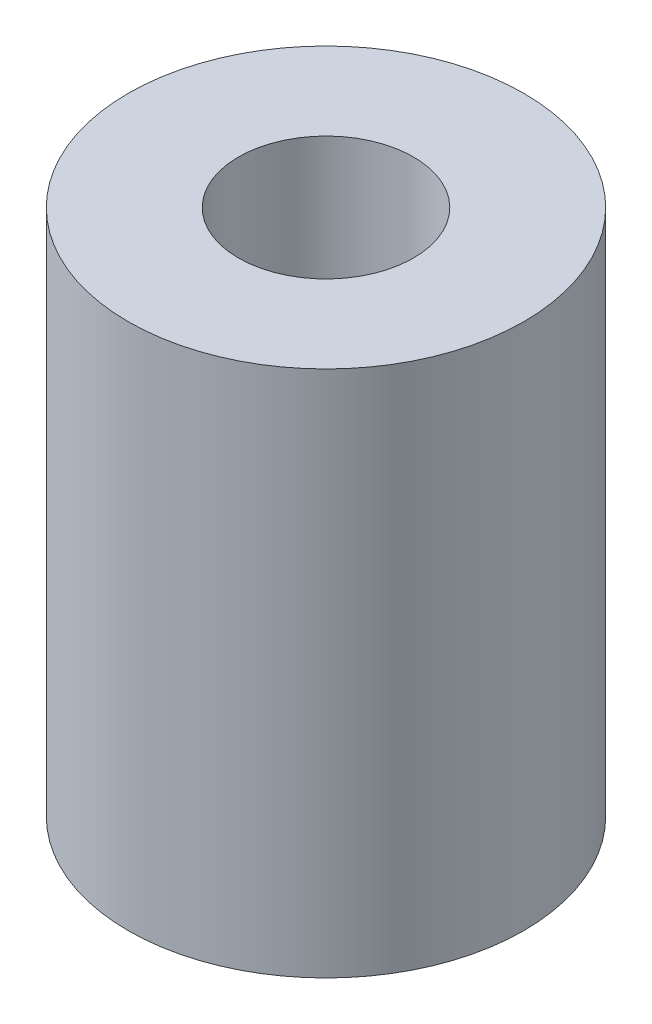
ISO-10303-21;
HEADER;
FILE_DESCRIPTION(('STEP AP214'),'2;1');
FILE_NAME('part.step','',(''),(''),'','','');
FILE_SCHEMA(('AUTOMOTIVE_DESIGN { 1 0 10303 214 1 1 1 1 }'));
ENDSEC;
DATA;
#1=APPLICATION_CONTEXT('core data for automotive mechanical design processes');
#2=APPLICATION_PROTOCOL_DEFINITION('international standard','automotive_design',2000,#1);
#3=PRODUCT_CONTEXT('',#1,'mechanical');
#4=PRODUCT('Part','Part','',(#3));
#5=PRODUCT_RELATED_PRODUCT_CATEGORY('part','',(#4));
#6=PRODUCT_DEFINITION_FORMATION('','',#4);
#7=PRODUCT_DEFINITION_CONTEXT('part definition',#1,'design');
#8=PRODUCT_DEFINITION('design','',#6,#7);
#9=PRODUCT_DEFINITION_SHAPE('','',#8);
#10=(LENGTH_UNIT() NAMED_UNIT(*) SI_UNIT(.MILLI.,.METRE.));
#11=(NAMED_UNIT(*) PLANE_ANGLE_UNIT() SI_UNIT($,.RADIAN.));
#12=(NAMED_UNIT(*) SI_UNIT($,.STERADIAN.) SOLID_ANGLE_UNIT());
#13=UNCERTAINTY_MEASURE_WITH_UNIT(LENGTH_MEASURE(1.E-05),#10,'distance_accuracy_value','');
#14=(GEOMETRIC_REPRESENTATION_CONTEXT(3) GLOBAL_UNCERTAINTY_ASSIGNED_CONTEXT((#13)) GLOBAL_UNIT_ASSIGNED_CONTEXT((#10,
#11,#12)) REPRESENTATION_CONTEXT('',''));
#15=CARTESIAN_POINT('',(0.,0.,0.));
#16=DIRECTION('',(0.,0.,1.));
#17=DIRECTION('',(1.,0.,0.));
#18=AXIS2_PLACEMENT_3D('',#15,#16,#17);
#19=CARTESIAN_POINT('',(0.,12.7,0.));
#20=DIRECTION('',(0.,1.,0.));
#21=DIRECTION('',(0.,0.,1.));
#22=AXIS2_PLACEMENT_3D('',#19,#20,#21);
#23=PLANE('',#22);
#24=CARTESIAN_POINT('',(0.,12.7,0.));
#25=DIRECTION('',(0.,1.,0.));
#26=DIRECTION('',(0.,0.,1.));
#27=AXIS2_PLACEMENT_3D('',#24,#25,#26);
#28=CIRCLE('',#27,4.7625);
#29=CARTESIAN_POINT('',(0.,12.7,4.7625));
#30=VERTEX_POINT('',#29);
#31=EDGE_CURVE('E10',#30,#30,#28,.T.);
#32=ORIENTED_EDGE('',*,*,#31,.T.);
#33=EDGE_LOOP('',(#32));
#34=FACE_BOUND('',#33,.T.);
#35=CARTESIAN_POINT('',(0.,12.7,0.));
#36=DIRECTION('',(0.,1.,0.));
#37=DIRECTION('',(0.,0.,1.));
#38=AXIS2_PLACEMENT_3D('',#35,#36,#37);
#39=CIRCLE('',#38,2.1082);
#40=CARTESIAN_POINT('',(0.,12.7,2.1082));
#41=VERTEX_POINT('',#40);
#42=EDGE_CURVE('E50',#41,#41,#39,.T.);
#43=ORIENTED_EDGE('',*,*,#42,.F.);
#44=EDGE_LOOP('',(#43));
#45=FACE_BOUND('',#44,.T.);
#46=ADVANCED_FACE('F37',(#34,#45),#23,.T.);
#47=CARTESIAN_POINT('',(0.,0.,0.));
#48=DIRECTION('',(0.,1.,0.));
#49=DIRECTION('',(0.,0.,1.));
#50=AXIS2_PLACEMENT_3D('',#47,#48,#49);
#51=PLANE('',#50);
#52=CARTESIAN_POINT('',(0.,0.,0.));
#53=DIRECTION('',(0.,1.,0.));
#54=DIRECTION('',(0.,0.,1.));
#55=AXIS2_PLACEMENT_3D('',#52,#53,#54);
#56=CIRCLE('',#55,4.7625);
#57=CARTESIAN_POINT('',(0.,0.,4.7625));
#58=VERTEX_POINT('',#57);
#59=EDGE_CURVE('E41',#58,#58,#56,.T.);
#60=ORIENTED_EDGE('',*,*,#59,.F.);
#61=EDGE_LOOP('',(#60));
#62=FACE_BOUND('',#61,.T.);
#63=CARTESIAN_POINT('',(0.,0.,0.));
#64=DIRECTION('',(0.,1.,0.));
#65=DIRECTION('',(0.,0.,1.));
#66=AXIS2_PLACEMENT_3D('',#63,#64,#65);
#67=CIRCLE('',#66,2.1082);
#68=CARTESIAN_POINT('',(0.,0.,2.1082));
#69=VERTEX_POINT('',#68);
#70=EDGE_CURVE('E52',#69,#69,#67,.T.);
#71=ORIENTED_EDGE('',*,*,#70,.T.);
#72=EDGE_LOOP('',(#71));
#73=FACE_BOUND('',#72,.T.);
#74=ADVANCED_FACE('F64',(#62,#73),#51,.F.);
#75=CARTESIAN_POINT('',(0.,12.7,0.));
#76=DIRECTION('',(0.,-1.,0.));
#77=DIRECTION('',(0.,0.,-1.));
#78=AXIS2_PLACEMENT_3D('',#75,#76,#77);
#79=CYLINDRICAL_SURFACE('',#78,4.7625);
#80=ORIENTED_EDGE('',*,*,#31,.F.);
#81=EDGE_LOOP('',(#80));
#82=FACE_BOUND('',#81,.T.);
#83=ORIENTED_EDGE('',*,*,#59,.T.);
#84=EDGE_LOOP('',(#83));
#85=FACE_BOUND('',#84,.T.);
#86=ADVANCED_FACE('F39',(#82,#85),#79,.T.);
#87=CARTESIAN_POINT('',(0.,12.7,0.));
#88=DIRECTION('',(0.,-1.,0.));
#89=DIRECTION('',(0.,0.,-1.));
#90=AXIS2_PLACEMENT_3D('',#87,#88,#89);
#91=CYLINDRICAL_SURFACE('',#90,2.1082);
#92=ORIENTED_EDGE('',*,*,#42,.T.);
#93=EDGE_LOOP('',(#92));
#94=FACE_BOUND('',#93,.T.);
#95=ORIENTED_EDGE('',*,*,#70,.F.);
#96=EDGE_LOOP('',(#95));
#97=FACE_BOUND('',#96,.T.);
#98=ADVANCED_FACE('F60',(#94,#97),#91,.F.);
#99=CLOSED_SHELL('',(#46,#74,#86,#98));
#100=MANIFOLD_SOLID_BREP('B2',#99);
#101=ADVANCED_BREP_SHAPE_REPRESENTATION('',(#18,#100),#14);
#102=SHAPE_DEFINITION_REPRESENTATION(#9,#101);
ENDSEC;
END-ISO-10303-21;
